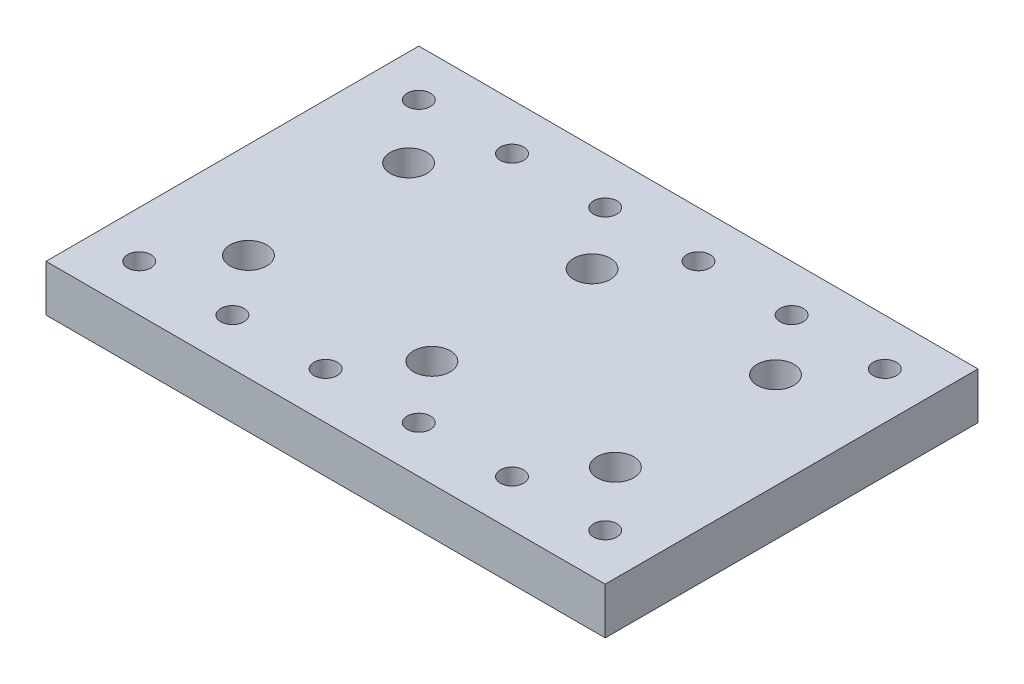
ISO-10303-21;
HEADER;
FILE_DESCRIPTION(('STEP AP214'),'2;1');
FILE_NAME('part.step','',(''),(''),'','','');
FILE_SCHEMA(('AUTOMOTIVE_DESIGN { 1 0 10303 214 1 1 1 1 }'));
ENDSEC;
DATA;
#1=APPLICATION_CONTEXT('core data for automotive mechanical design processes');
#2=APPLICATION_PROTOCOL_DEFINITION('international standard','automotive_design',2000,#1);
#3=PRODUCT_CONTEXT('',#1,'mechanical');
#4=PRODUCT('Part','Part','',(#3));
#5=PRODUCT_RELATED_PRODUCT_CATEGORY('part','',(#4));
#6=PRODUCT_DEFINITION_FORMATION('','',#4);
#7=PRODUCT_DEFINITION_CONTEXT('part definition',#1,'design');
#8=PRODUCT_DEFINITION('design','',#6,#7);
#9=PRODUCT_DEFINITION_SHAPE('','',#8);
#10=(LENGTH_UNIT() NAMED_UNIT(*) SI_UNIT(.MILLI.,.METRE.));
#11=(NAMED_UNIT(*) PLANE_ANGLE_UNIT() SI_UNIT($,.RADIAN.));
#12=(NAMED_UNIT(*) SI_UNIT($,.STERADIAN.) SOLID_ANGLE_UNIT());
#13=UNCERTAINTY_MEASURE_WITH_UNIT(LENGTH_MEASURE(1.E-05),#10,'distance_accuracy_value','');
#14=(GEOMETRIC_REPRESENTATION_CONTEXT(3) GLOBAL_UNCERTAINTY_ASSIGNED_CONTEXT((#13)) GLOBAL_UNIT_ASSIGNED_CONTEXT((#10,
#11,#12)) REPRESENTATION_CONTEXT('',''));
#15=CARTESIAN_POINT('',(0.,0.,0.));
#16=DIRECTION('',(0.,0.,1.));
#17=DIRECTION('',(1.,0.,0.));
#18=AXIS2_PLACEMENT_3D('',#15,#16,#17);
#19=CARTESIAN_POINT('',(76.2,12.7,50.8));
#20=DIRECTION('',(-1.,0.,0.));
#21=DIRECTION('',(0.,0.,1.));
#22=AXIS2_PLACEMENT_3D('',#19,#20,#21);
#23=PLANE('',#22);
#24=DIRECTION('',(0.,0.,-1.));
#25=VECTOR('',#24,1.);
#26=CARTESIAN_POINT('',(76.2,0.,50.8));
#27=LINE('',#26,#25);
#28=CARTESIAN_POINT('',(76.2,0.,50.8));
#29=VERTEX_POINT('',#28);
#30=CARTESIAN_POINT('',(76.2,0.,-50.8));
#31=VERTEX_POINT('',#30);
#32=EDGE_CURVE('E95',#29,#31,#27,.T.);
#33=ORIENTED_EDGE('',*,*,#32,.T.);
#34=DIRECTION('',(0.,-1.,0.));
#35=VECTOR('',#34,1.);
#36=CARTESIAN_POINT('',(76.2,12.7,-50.8));
#37=LINE('',#36,#35);
#38=CARTESIAN_POINT('',(76.2,12.7,-50.8));
#39=VERTEX_POINT('',#38);
#40=EDGE_CURVE('E11',#39,#31,#37,.T.);
#41=ORIENTED_EDGE('',*,*,#40,.F.);
#42=DIRECTION('',(0.,0.,-1.));
#43=VECTOR('',#42,1.);
#44=CARTESIAN_POINT('',(76.2,12.7,50.8));
#45=LINE('',#44,#43);
#46=CARTESIAN_POINT('',(76.2,12.7,50.8));
#47=VERTEX_POINT('',#46);
#48=EDGE_CURVE('E83',#47,#39,#45,.T.);
#49=ORIENTED_EDGE('',*,*,#48,.F.);
#50=DIRECTION('',(0.,-1.,0.));
#51=VECTOR('',#50,1.);
#52=CARTESIAN_POINT('',(76.2,12.7,50.8));
#53=LINE('',#52,#51);
#54=EDGE_CURVE('E91',#47,#29,#53,.T.);
#55=ORIENTED_EDGE('',*,*,#54,.T.);
#56=EDGE_LOOP('',(#33,#41,#49,#55));
#57=FACE_BOUND('',#56,.T.);
#58=ADVANCED_FACE('F32',(#57),#23,.F.);
#59=CARTESIAN_POINT('',(-76.2,12.7,-50.8));
#60=DIRECTION('',(0.,0.,1.));
#61=DIRECTION('',(1.,0.,0.));
#62=AXIS2_PLACEMENT_3D('',#59,#60,#61);
#63=PLANE('',#62);
#64=DIRECTION('',(-1.,0.,0.));
#65=VECTOR('',#64,1.);
#66=CARTESIAN_POINT('',(-76.2,0.,-50.8));
#67=LINE('',#66,#65);
#68=CARTESIAN_POINT('',(-76.2,0.,-50.8));
#69=VERTEX_POINT('',#68);
#70=EDGE_CURVE('E87',#31,#69,#67,.T.);
#71=ORIENTED_EDGE('',*,*,#70,.T.);
#72=DIRECTION('',(0.,-1.,0.));
#73=VECTOR('',#72,1.);
#74=CARTESIAN_POINT('',(-76.2,12.7,-50.8));
#75=LINE('',#74,#73);
#76=CARTESIAN_POINT('',(-76.2,12.7,-50.8));
#77=VERTEX_POINT('',#76);
#78=EDGE_CURVE('E40',#77,#69,#75,.T.);
#79=ORIENTED_EDGE('',*,*,#78,.F.);
#80=DIRECTION('',(-1.,0.,0.));
#81=VECTOR('',#80,1.);
#82=CARTESIAN_POINT('',(-76.2,12.7,-50.8));
#83=LINE('',#82,#81);
#84=EDGE_CURVE('E78',#39,#77,#83,.T.);
#85=ORIENTED_EDGE('',*,*,#84,.F.);
#86=ORIENTED_EDGE('',*,*,#40,.T.);
#87=EDGE_LOOP('',(#71,#79,#85,#86));
#88=FACE_BOUND('',#87,.T.);
#89=ADVANCED_FACE('F86',(#88),#63,.F.);
#90=CARTESIAN_POINT('',(-76.2,12.7,50.8));
#91=DIRECTION('',(1.,0.,0.));
#92=DIRECTION('',(0.,0.,-1.));
#93=AXIS2_PLACEMENT_3D('',#90,#91,#92);
#94=PLANE('',#93);
#95=DIRECTION('',(0.,0.,1.));
#96=VECTOR('',#95,1.);
#97=CARTESIAN_POINT('',(-76.2,0.,50.8));
#98=LINE('',#97,#96);
#99=CARTESIAN_POINT('',(-76.2,0.,50.8));
#100=VERTEX_POINT('',#99);
#101=EDGE_CURVE('E65',#69,#100,#98,.T.);
#102=ORIENTED_EDGE('',*,*,#101,.T.);
#103=DIRECTION('',(0.,-1.,0.));
#104=VECTOR('',#103,1.);
#105=CARTESIAN_POINT('',(-76.2,12.7,50.8));
#106=LINE('',#105,#104);
#107=CARTESIAN_POINT('',(-76.2,12.7,50.8));
#108=VERTEX_POINT('',#107);
#109=EDGE_CURVE('E88',#108,#100,#106,.T.);
#110=ORIENTED_EDGE('',*,*,#109,.F.);
#111=DIRECTION('',(0.,0.,1.));
#112=VECTOR('',#111,1.);
#113=CARTESIAN_POINT('',(-76.2,12.7,50.8));
#114=LINE('',#113,#112);
#115=EDGE_CURVE('E81',#77,#108,#114,.T.);
#116=ORIENTED_EDGE('',*,*,#115,.F.);
#117=ORIENTED_EDGE('',*,*,#78,.T.);
#118=EDGE_LOOP('',(#102,#110,#116,#117));
#119=FACE_BOUND('',#118,.T.);
#120=ADVANCED_FACE('F89',(#119),#94,.F.);
#121=CARTESIAN_POINT('',(-76.2,12.7,50.8));
#122=DIRECTION('',(0.,0.,-1.));
#123=DIRECTION('',(-1.,0.,0.));
#124=AXIS2_PLACEMENT_3D('',#121,#122,#123);
#125=PLANE('',#124);
#126=DIRECTION('',(1.,0.,0.));
#127=VECTOR('',#126,1.);
#128=CARTESIAN_POINT('',(-76.2,0.,50.8));
#129=LINE('',#128,#127);
#130=EDGE_CURVE('E71',#100,#29,#129,.T.);
#131=ORIENTED_EDGE('',*,*,#130,.T.);
#132=ORIENTED_EDGE('',*,*,#54,.F.);
#133=DIRECTION('',(1.,0.,0.));
#134=VECTOR('',#133,1.);
#135=CARTESIAN_POINT('',(-76.2,12.7,50.8));
#136=LINE('',#135,#134);
#137=EDGE_CURVE('E48',#108,#47,#136,.T.);
#138=ORIENTED_EDGE('',*,*,#137,.F.);
#139=ORIENTED_EDGE('',*,*,#109,.T.);
#140=EDGE_LOOP('',(#131,#132,#138,#139));
#141=FACE_BOUND('',#140,.T.);
#142=ADVANCED_FACE('F103',(#141),#125,.F.);
#143=CARTESIAN_POINT('',(0.,12.7,0.));
#144=DIRECTION('',(0.,-1.,0.));
#145=DIRECTION('',(0.,0.,-1.));
#146=AXIS2_PLACEMENT_3D('',#143,#144,#145);
#147=PLANE('',#146);
#148=CARTESIAN_POINT('',(-38.1,12.7,38.1));
#149=DIRECTION('',(0.,1.,0.));
#150=DIRECTION('',(0.,0.,1.));
#151=AXIS2_PLACEMENT_3D('',#148,#149,#150);
#152=CIRCLE('',#151,3.175);
#153=CARTESIAN_POINT('',(-38.1,12.7,41.275));
#154=VERTEX_POINT('',#153);
#155=EDGE_CURVE('E211',#154,#154,#152,.T.);
#156=ORIENTED_EDGE('',*,*,#155,.F.);
#157=EDGE_LOOP('',(#156));
#158=FACE_BOUND('',#157,.T.);
#159=CARTESIAN_POINT('',(-12.7,12.7,38.1));
#160=DIRECTION('',(0.,1.,0.));
#161=DIRECTION('',(0.,0.,1.));
#162=AXIS2_PLACEMENT_3D('',#159,#160,#161);
#163=CIRCLE('',#162,3.175);
#164=CARTESIAN_POINT('',(-12.7,12.7,41.275));
#165=VERTEX_POINT('',#164);
#166=EDGE_CURVE('E205',#165,#165,#163,.T.);
#167=ORIENTED_EDGE('',*,*,#166,.F.);
#168=EDGE_LOOP('',(#167));
#169=FACE_BOUND('',#168,.T.);
#170=CARTESIAN_POINT('',(12.7,12.7,38.1));
#171=DIRECTION('',(0.,1.,0.));
#172=DIRECTION('',(0.,0.,1.));
#173=AXIS2_PLACEMENT_3D('',#170,#171,#172);
#174=CIRCLE('',#173,3.175);
#175=CARTESIAN_POINT('',(12.7,12.7,41.275));
#176=VERTEX_POINT('',#175);
#177=EDGE_CURVE('E199',#176,#176,#174,.T.);
#178=ORIENTED_EDGE('',*,*,#177,.F.);
#179=EDGE_LOOP('',(#178));
#180=FACE_BOUND('',#179,.T.);
#181=CARTESIAN_POINT('',(38.1,12.7,38.1));
#182=DIRECTION('',(0.,1.,0.));
#183=DIRECTION('',(0.,0.,1.));
#184=AXIS2_PLACEMENT_3D('',#181,#182,#183);
#185=CIRCLE('',#184,3.175);
#186=CARTESIAN_POINT('',(38.1,12.7,41.275));
#187=VERTEX_POINT('',#186);
#188=EDGE_CURVE('E193',#187,#187,#185,.T.);
#189=ORIENTED_EDGE('',*,*,#188,.F.);
#190=EDGE_LOOP('',(#189));
#191=FACE_BOUND('',#190,.T.);
#192=CARTESIAN_POINT('',(63.5,12.7,38.1));
#193=DIRECTION('',(0.,1.,0.));
#194=DIRECTION('',(0.,0.,1.));
#195=AXIS2_PLACEMENT_3D('',#192,#193,#194);
#196=CIRCLE('',#195,3.175);
#197=CARTESIAN_POINT('',(63.5,12.7,41.275));
#198=VERTEX_POINT('',#197);
#199=EDGE_CURVE('E170',#198,#198,#196,.T.);
#200=ORIENTED_EDGE('',*,*,#199,.F.);
#201=EDGE_LOOP('',(#200));
#202=FACE_BOUND('',#201,.T.);
#203=CARTESIAN_POINT('',(38.0999999999997,12.7,-38.1));
#204=DIRECTION('',(0.,1.,0.));
#205=DIRECTION('',(0.,0.,1.));
#206=AXIS2_PLACEMENT_3D('',#203,#204,#205);
#207=CIRCLE('',#206,3.175);
#208=CARTESIAN_POINT('',(38.0999999999997,12.7,-34.925));
#209=VERTEX_POINT('',#208);
#210=EDGE_CURVE('E171',#209,#209,#207,.T.);
#211=ORIENTED_EDGE('',*,*,#210,.F.);
#212=EDGE_LOOP('',(#211));
#213=FACE_BOUND('',#212,.T.);
#214=CARTESIAN_POINT('',(63.4999999999997,12.7,-38.1));
#215=DIRECTION('',(0.,1.,0.));
#216=DIRECTION('',(0.,0.,1.));
#217=AXIS2_PLACEMENT_3D('',#214,#215,#216);
#218=CIRCLE('',#217,3.175);
#219=CARTESIAN_POINT('',(63.4999999999997,12.7,-34.925));
#220=VERTEX_POINT('',#219);
#221=EDGE_CURVE('E183',#220,#220,#218,.T.);
#222=ORIENTED_EDGE('',*,*,#221,.F.);
#223=EDGE_LOOP('',(#222));
#224=FACE_BOUND('',#223,.T.);
#225=CARTESIAN_POINT('',(-63.5000000000002,12.7,-38.1));
#226=DIRECTION('',(0.,1.,0.));
#227=DIRECTION('',(0.,0.,1.));
#228=AXIS2_PLACEMENT_3D('',#225,#226,#227);
#229=CIRCLE('',#228,3.175);
#230=CARTESIAN_POINT('',(-63.5000000000002,12.7,-34.925));
#231=VERTEX_POINT('',#230);
#232=EDGE_CURVE('E177',#231,#231,#229,.T.);
#233=ORIENTED_EDGE('',*,*,#232,.F.);
#234=EDGE_LOOP('',(#233));
#235=FACE_BOUND('',#234,.T.);
#236=CARTESIAN_POINT('',(12.6999999999997,12.7,-38.1));
#237=DIRECTION('',(0.,1.,0.));
#238=DIRECTION('',(0.,0.,1.));
#239=AXIS2_PLACEMENT_3D('',#236,#237,#238);
#240=CIRCLE('',#239,3.175);
#241=CARTESIAN_POINT('',(12.6999999999997,12.7,-34.925));
#242=VERTEX_POINT('',#241);
#243=EDGE_CURVE('E151',#242,#242,#240,.T.);
#244=ORIENTED_EDGE('',*,*,#243,.F.);
#245=EDGE_LOOP('',(#244));
#246=FACE_BOUND('',#245,.T.);
#247=CARTESIAN_POINT('',(-12.7000000000003,12.7,-38.1));
#248=DIRECTION('',(0.,1.,0.));
#249=DIRECTION('',(0.,0.,1.));
#250=AXIS2_PLACEMENT_3D('',#247,#248,#249);
#251=CIRCLE('',#250,3.175);
#252=CARTESIAN_POINT('',(-12.7000000000003,12.7,-34.925));
#253=VERTEX_POINT('',#252);
#254=EDGE_CURVE('E158',#253,#253,#251,.T.);
#255=ORIENTED_EDGE('',*,*,#254,.F.);
#256=EDGE_LOOP('',(#255));
#257=FACE_BOUND('',#256,.T.);
#258=CARTESIAN_POINT('',(-38.1000000000003,12.7,-38.1));
#259=DIRECTION('',(0.,1.,0.));
#260=DIRECTION('',(0.,0.,1.));
#261=AXIS2_PLACEMENT_3D('',#258,#259,#260);
#262=CIRCLE('',#261,3.175);
#263=CARTESIAN_POINT('',(-38.1000000000003,12.7,-34.925));
#264=VERTEX_POINT('',#263);
#265=EDGE_CURVE('E164',#264,#264,#262,.T.);
#266=ORIENTED_EDGE('',*,*,#265,.F.);
#267=EDGE_LOOP('',(#266));
#268=FACE_BOUND('',#267,.T.);
#269=CARTESIAN_POINT('',(-63.5,12.7,38.1));
#270=DIRECTION('',(0.,1.,0.));
#271=DIRECTION('',(0.,0.,1.));
#272=AXIS2_PLACEMENT_3D('',#269,#270,#271);
#273=CIRCLE('',#272,3.175);
#274=CARTESIAN_POINT('',(-63.5,12.7,41.275));
#275=VERTEX_POINT('',#274);
#276=EDGE_CURVE('E145',#275,#275,#273,.T.);
#277=ORIENTED_EDGE('',*,*,#276,.F.);
#278=EDGE_LOOP('',(#277));
#279=FACE_BOUND('',#278,.T.);
#280=CARTESIAN_POINT('',(49.9957939432397,12.7,-21.825));
#281=DIRECTION('',(0.,-1.,0.));
#282=DIRECTION('',(0.,0.,-1.));
#283=AXIS2_PLACEMENT_3D('',#280,#281,#282);
#284=CIRCLE('',#283,4.99999999999999);
#285=CARTESIAN_POINT('',(49.9957939432397,12.7,-26.825));
#286=VERTEX_POINT('',#285);
#287=EDGE_CURVE('E130',#286,#286,#284,.T.);
#288=ORIENTED_EDGE('',*,*,#287,.T.);
#289=EDGE_LOOP('',(#288));
#290=FACE_BOUND('',#289,.T.);
#291=CARTESIAN_POINT('',(49.9957939432397,12.7,21.825));
#292=DIRECTION('',(0.,-1.,0.));
#293=DIRECTION('',(0.,0.,-1.));
#294=AXIS2_PLACEMENT_3D('',#291,#292,#293);
#295=CIRCLE('',#294,4.99999999999999);
#296=CARTESIAN_POINT('',(49.9957939432397,12.7,16.825));
#297=VERTEX_POINT('',#296);
#298=EDGE_CURVE('E137',#297,#297,#295,.T.);
#299=ORIENTED_EDGE('',*,*,#298,.T.);
#300=EDGE_LOOP('',(#299));
#301=FACE_BOUND('',#300,.T.);
#302=CARTESIAN_POINT('',(-0.00420605676025587,12.7,-21.825));
#303=DIRECTION('',(0.,-1.,0.));
#304=DIRECTION('',(0.,0.,-1.));
#305=AXIS2_PLACEMENT_3D('',#302,#303,#304);
#306=CIRCLE('',#305,4.99999999999999);
#307=CARTESIAN_POINT('',(-0.00420605676025587,12.7,-26.825));
#308=VERTEX_POINT('',#307);
#309=EDGE_CURVE('E119',#308,#308,#306,.T.);
#310=ORIENTED_EDGE('',*,*,#309,.T.);
#311=EDGE_LOOP('',(#310));
#312=FACE_BOUND('',#311,.T.);
#313=CARTESIAN_POINT('',(-0.00420605676025587,12.7,21.825));
#314=DIRECTION('',(0.,-1.,0.));
#315=DIRECTION('',(0.,0.,-1.));
#316=AXIS2_PLACEMENT_3D('',#313,#314,#315);
#317=CIRCLE('',#316,4.99999999999999);
#318=CARTESIAN_POINT('',(-0.00420605676025587,12.7,16.825));
#319=VERTEX_POINT('',#318);
#320=EDGE_CURVE('E118',#319,#319,#317,.T.);
#321=ORIENTED_EDGE('',*,*,#320,.T.);
#322=EDGE_LOOP('',(#321));
#323=FACE_BOUND('',#322,.T.);
#324=CARTESIAN_POINT('',(-50.0042060567603,12.7,-21.825));
#325=DIRECTION('',(0.,-1.,0.));
#326=DIRECTION('',(0.,0.,-1.));
#327=AXIS2_PLACEMENT_3D('',#324,#325,#326);
#328=CIRCLE('',#327,4.99999999999999);
#329=CARTESIAN_POINT('',(-50.0042060567603,12.7,-26.825));
#330=VERTEX_POINT('',#329);
#331=EDGE_CURVE('E112',#330,#330,#328,.T.);
#332=ORIENTED_EDGE('',*,*,#331,.T.);
#333=EDGE_LOOP('',(#332));
#334=FACE_BOUND('',#333,.T.);
#335=CARTESIAN_POINT('',(-50.0042060567603,12.7,21.825));
#336=DIRECTION('',(0.,-1.,0.));
#337=DIRECTION('',(0.,0.,-1.));
#338=AXIS2_PLACEMENT_3D('',#335,#336,#337);
#339=CIRCLE('',#338,4.99999999999999);
#340=CARTESIAN_POINT('',(-50.0042060567603,12.7,16.825));
#341=VERTEX_POINT('',#340);
#342=EDGE_CURVE('E98',#341,#341,#339,.T.);
#343=ORIENTED_EDGE('',*,*,#342,.T.);
#344=EDGE_LOOP('',(#343));
#345=FACE_BOUND('',#344,.T.);
#346=ORIENTED_EDGE('',*,*,#48,.T.);
#347=ORIENTED_EDGE('',*,*,#84,.T.);
#348=ORIENTED_EDGE('',*,*,#115,.T.);
#349=ORIENTED_EDGE('',*,*,#137,.T.);
#350=EDGE_LOOP('',(#346,#347,#348,#349));
#351=FACE_BOUND('',#350,.T.);
#352=ADVANCED_FACE('F79',(#158,#169,#180,#191,#202,#213,#224,#235,#246,#257,#268,#279,#290,#301,
#312,#323,#334,#345,#351),#147,.F.);
#353=CARTESIAN_POINT('',(0.,0.,0.));
#354=DIRECTION('',(0.,-1.,0.));
#355=DIRECTION('',(0.,0.,-1.));
#356=AXIS2_PLACEMENT_3D('',#353,#354,#355);
#357=PLANE('',#356);
#358=CARTESIAN_POINT('',(-38.1,0.,38.1));
#359=DIRECTION('',(0.,1.,0.));
#360=DIRECTION('',(0.,0.,1.));
#361=AXIS2_PLACEMENT_3D('',#358,#359,#360);
#362=CIRCLE('',#361,3.175);
#363=CARTESIAN_POINT('',(-38.1,0.,41.275));
#364=VERTEX_POINT('',#363);
#365=EDGE_CURVE('E148',#364,#364,#362,.T.);
#366=ORIENTED_EDGE('',*,*,#365,.T.);
#367=EDGE_LOOP('',(#366));
#368=FACE_BOUND('',#367,.T.);
#369=CARTESIAN_POINT('',(-12.7,0.,38.1));
#370=DIRECTION('',(0.,1.,0.));
#371=DIRECTION('',(0.,0.,1.));
#372=AXIS2_PLACEMENT_3D('',#369,#370,#371);
#373=CIRCLE('',#372,3.175);
#374=CARTESIAN_POINT('',(-12.7,0.,41.275));
#375=VERTEX_POINT('',#374);
#376=EDGE_CURVE('E208',#375,#375,#373,.T.);
#377=ORIENTED_EDGE('',*,*,#376,.T.);
#378=EDGE_LOOP('',(#377));
#379=FACE_BOUND('',#378,.T.);
#380=CARTESIAN_POINT('',(12.7,0.,38.1));
#381=DIRECTION('',(0.,1.,0.));
#382=DIRECTION('',(0.,0.,1.));
#383=AXIS2_PLACEMENT_3D('',#380,#381,#382);
#384=CIRCLE('',#383,3.175);
#385=CARTESIAN_POINT('',(12.7,0.,41.275));
#386=VERTEX_POINT('',#385);
#387=EDGE_CURVE('E202',#386,#386,#384,.T.);
#388=ORIENTED_EDGE('',*,*,#387,.T.);
#389=EDGE_LOOP('',(#388));
#390=FACE_BOUND('',#389,.T.);
#391=CARTESIAN_POINT('',(38.1,0.,38.1));
#392=DIRECTION('',(0.,1.,0.));
#393=DIRECTION('',(0.,0.,1.));
#394=AXIS2_PLACEMENT_3D('',#391,#392,#393);
#395=CIRCLE('',#394,3.175);
#396=CARTESIAN_POINT('',(38.1,0.,41.275));
#397=VERTEX_POINT('',#396);
#398=EDGE_CURVE('E196',#397,#397,#395,.T.);
#399=ORIENTED_EDGE('',*,*,#398,.T.);
#400=EDGE_LOOP('',(#399));
#401=FACE_BOUND('',#400,.T.);
#402=CARTESIAN_POINT('',(63.5,0.,38.1));
#403=DIRECTION('',(0.,1.,0.));
#404=DIRECTION('',(0.,0.,1.));
#405=AXIS2_PLACEMENT_3D('',#402,#403,#404);
#406=CIRCLE('',#405,3.175);
#407=CARTESIAN_POINT('',(63.5,0.,41.275));
#408=VERTEX_POINT('',#407);
#409=EDGE_CURVE('E190',#408,#408,#406,.T.);
#410=ORIENTED_EDGE('',*,*,#409,.T.);
#411=EDGE_LOOP('',(#410));
#412=FACE_BOUND('',#411,.T.);
#413=CARTESIAN_POINT('',(38.0999999999997,0.,-38.1));
#414=DIRECTION('',(0.,1.,0.));
#415=DIRECTION('',(0.,0.,1.));
#416=AXIS2_PLACEMENT_3D('',#413,#414,#415);
#417=CIRCLE('',#416,3.175);
#418=CARTESIAN_POINT('',(38.0999999999997,0.,-34.925));
#419=VERTEX_POINT('',#418);
#420=EDGE_CURVE('E155',#419,#419,#417,.T.);
#421=ORIENTED_EDGE('',*,*,#420,.T.);
#422=EDGE_LOOP('',(#421));
#423=FACE_BOUND('',#422,.T.);
#424=CARTESIAN_POINT('',(63.4999999999997,0.,-38.1));
#425=DIRECTION('',(0.,1.,0.));
#426=DIRECTION('',(0.,0.,1.));
#427=AXIS2_PLACEMENT_3D('',#424,#425,#426);
#428=CIRCLE('',#427,3.175);
#429=CARTESIAN_POINT('',(63.4999999999997,0.,-34.925));
#430=VERTEX_POINT('',#429);
#431=EDGE_CURVE('E174',#430,#430,#428,.T.);
#432=ORIENTED_EDGE('',*,*,#431,.T.);
#433=EDGE_LOOP('',(#432));
#434=FACE_BOUND('',#433,.T.);
#435=CARTESIAN_POINT('',(-63.5000000000002,0.,-38.1));
#436=DIRECTION('',(0.,1.,0.));
#437=DIRECTION('',(0.,0.,1.));
#438=AXIS2_PLACEMENT_3D('',#435,#436,#437);
#439=CIRCLE('',#438,3.175);
#440=CARTESIAN_POINT('',(-63.5000000000002,0.,-34.925));
#441=VERTEX_POINT('',#440);
#442=EDGE_CURVE('E180',#441,#441,#439,.T.);
#443=ORIENTED_EDGE('',*,*,#442,.T.);
#444=EDGE_LOOP('',(#443));
#445=FACE_BOUND('',#444,.T.);
#446=CARTESIAN_POINT('',(12.6999999999997,0.,-38.1));
#447=DIRECTION('',(0.,1.,0.));
#448=DIRECTION('',(0.,0.,1.));
#449=AXIS2_PLACEMENT_3D('',#446,#447,#448);
#450=CIRCLE('',#449,3.175);
#451=CARTESIAN_POINT('',(12.6999999999997,0.,-34.925));
#452=VERTEX_POINT('',#451);
#453=EDGE_CURVE('E154',#452,#452,#450,.T.);
#454=ORIENTED_EDGE('',*,*,#453,.T.);
#455=EDGE_LOOP('',(#454));
#456=FACE_BOUND('',#455,.T.);
#457=CARTESIAN_POINT('',(-12.7000000000003,0.,-38.1));
#458=DIRECTION('',(0.,1.,0.));
#459=DIRECTION('',(0.,0.,1.));
#460=AXIS2_PLACEMENT_3D('',#457,#458,#459);
#461=CIRCLE('',#460,3.175);
#462=CARTESIAN_POINT('',(-12.7000000000003,0.,-34.925));
#463=VERTEX_POINT('',#462);
#464=EDGE_CURVE('E161',#463,#463,#461,.T.);
#465=ORIENTED_EDGE('',*,*,#464,.T.);
#466=EDGE_LOOP('',(#465));
#467=FACE_BOUND('',#466,.T.);
#468=CARTESIAN_POINT('',(-38.1000000000003,0.,-38.1));
#469=DIRECTION('',(0.,1.,0.));
#470=DIRECTION('',(0.,0.,1.));
#471=AXIS2_PLACEMENT_3D('',#468,#469,#470);
#472=CIRCLE('',#471,3.175);
#473=CARTESIAN_POINT('',(-38.1000000000003,0.,-34.925));
#474=VERTEX_POINT('',#473);
#475=EDGE_CURVE('E167',#474,#474,#472,.T.);
#476=ORIENTED_EDGE('',*,*,#475,.T.);
#477=EDGE_LOOP('',(#476));
#478=FACE_BOUND('',#477,.T.);
#479=CARTESIAN_POINT('',(-63.5,0.,38.1));
#480=DIRECTION('',(0.,1.,0.));
#481=DIRECTION('',(0.,0.,1.));
#482=AXIS2_PLACEMENT_3D('',#479,#480,#481);
#483=CIRCLE('',#482,3.175);
#484=CARTESIAN_POINT('',(-63.5,0.,41.275));
#485=VERTEX_POINT('',#484);
#486=EDGE_CURVE('E131',#485,#485,#483,.T.);
#487=ORIENTED_EDGE('',*,*,#486,.T.);
#488=EDGE_LOOP('',(#487));
#489=FACE_BOUND('',#488,.T.);
#490=CARTESIAN_POINT('',(49.9957939432397,0.,-21.825));
#491=DIRECTION('',(0.,-1.,0.));
#492=DIRECTION('',(0.,0.,-1.));
#493=AXIS2_PLACEMENT_3D('',#490,#491,#492);
#494=CIRCLE('',#493,4.99999999999999);
#495=CARTESIAN_POINT('',(49.9957939432397,0.,-26.825));
#496=VERTEX_POINT('',#495);
#497=EDGE_CURVE('E127',#496,#496,#494,.T.);
#498=ORIENTED_EDGE('',*,*,#497,.F.);
#499=EDGE_LOOP('',(#498));
#500=FACE_BOUND('',#499,.T.);
#501=CARTESIAN_POINT('',(49.9957939432397,0.,21.825));
#502=DIRECTION('',(0.,-1.,0.));
#503=DIRECTION('',(0.,0.,-1.));
#504=AXIS2_PLACEMENT_3D('',#501,#502,#503);
#505=CIRCLE('',#504,4.99999999999999);
#506=CARTESIAN_POINT('',(49.9957939432397,0.,16.825));
#507=VERTEX_POINT('',#506);
#508=EDGE_CURVE('E134',#507,#507,#505,.T.);
#509=ORIENTED_EDGE('',*,*,#508,.F.);
#510=EDGE_LOOP('',(#509));
#511=FACE_BOUND('',#510,.T.);
#512=CARTESIAN_POINT('',(-0.00420605676025587,0.,-21.825));
#513=DIRECTION('',(0.,-1.,0.));
#514=DIRECTION('',(0.,0.,-1.));
#515=AXIS2_PLACEMENT_3D('',#512,#513,#514);
#516=CIRCLE('',#515,4.99999999999999);
#517=CARTESIAN_POINT('',(-0.00420605676025587,0.,-26.825));
#518=VERTEX_POINT('',#517);
#519=EDGE_CURVE('E140',#518,#518,#516,.T.);
#520=ORIENTED_EDGE('',*,*,#519,.F.);
#521=EDGE_LOOP('',(#520));
#522=FACE_BOUND('',#521,.T.);
#523=CARTESIAN_POINT('',(-0.00420605676025587,0.,21.825));
#524=DIRECTION('',(0.,-1.,0.));
#525=DIRECTION('',(0.,0.,-1.));
#526=AXIS2_PLACEMENT_3D('',#523,#524,#525);
#527=CIRCLE('',#526,4.99999999999999);
#528=CARTESIAN_POINT('',(-0.00420605676025587,0.,16.825));
#529=VERTEX_POINT('',#528);
#530=EDGE_CURVE('E115',#529,#529,#527,.T.);
#531=ORIENTED_EDGE('',*,*,#530,.F.);
#532=EDGE_LOOP('',(#531));
#533=FACE_BOUND('',#532,.T.);
#534=CARTESIAN_POINT('',(-50.0042060567603,0.,-21.825));
#535=DIRECTION('',(0.,-1.,0.));
#536=DIRECTION('',(0.,0.,-1.));
#537=AXIS2_PLACEMENT_3D('',#534,#535,#536);
#538=CIRCLE('',#537,4.99999999999999);
#539=CARTESIAN_POINT('',(-50.0042060567603,0.,-26.825));
#540=VERTEX_POINT('',#539);
#541=EDGE_CURVE('E122',#540,#540,#538,.T.);
#542=ORIENTED_EDGE('',*,*,#541,.F.);
#543=EDGE_LOOP('',(#542));
#544=FACE_BOUND('',#543,.T.);
#545=CARTESIAN_POINT('',(-50.0042060567603,0.,21.825));
#546=DIRECTION('',(0.,-1.,0.));
#547=DIRECTION('',(0.,0.,-1.));
#548=AXIS2_PLACEMENT_3D('',#545,#546,#547);
#549=CIRCLE('',#548,4.99999999999999);
#550=CARTESIAN_POINT('',(-50.0042060567603,0.,16.825));
#551=VERTEX_POINT('',#550);
#552=EDGE_CURVE('E109',#551,#551,#549,.T.);
#553=ORIENTED_EDGE('',*,*,#552,.F.);
#554=EDGE_LOOP('',(#553));
#555=FACE_BOUND('',#554,.T.);
#556=ORIENTED_EDGE('',*,*,#32,.F.);
#557=ORIENTED_EDGE('',*,*,#130,.F.);
#558=ORIENTED_EDGE('',*,*,#101,.F.);
#559=ORIENTED_EDGE('',*,*,#70,.F.);
#560=EDGE_LOOP('',(#556,#557,#558,#559));
#561=FACE_BOUND('',#560,.T.);
#562=ADVANCED_FACE('F106',(#368,#379,#390,#401,#412,#423,#434,#445,#456,#467,#478,#489,#500,
#511,#522,#533,#544,#555,#561),#357,.T.);
#563=CARTESIAN_POINT('',(-50.0042060567603,12.7,21.825));
#564=DIRECTION('',(0.,-1.,0.));
#565=DIRECTION('',(0.,0.,-1.));
#566=AXIS2_PLACEMENT_3D('',#563,#564,#565);
#567=CYLINDRICAL_SURFACE('',#566,4.99999999999999);
#568=ORIENTED_EDGE('',*,*,#342,.F.);
#569=EDGE_LOOP('',(#568));
#570=FACE_BOUND('',#569,.T.);
#571=ORIENTED_EDGE('',*,*,#552,.T.);
#572=EDGE_LOOP('',(#571));
#573=FACE_BOUND('',#572,.T.);
#574=ADVANCED_FACE('F263',(#570,#573),#567,.F.);
#575=CARTESIAN_POINT('',(-50.0042060567603,12.7,-21.825));
#576=DIRECTION('',(0.,-1.,0.));
#577=DIRECTION('',(0.,0.,-1.));
#578=AXIS2_PLACEMENT_3D('',#575,#576,#577);
#579=CYLINDRICAL_SURFACE('',#578,4.99999999999999);
#580=ORIENTED_EDGE('',*,*,#331,.F.);
#581=EDGE_LOOP('',(#580));
#582=FACE_BOUND('',#581,.T.);
#583=ORIENTED_EDGE('',*,*,#541,.T.);
#584=EDGE_LOOP('',(#583));
#585=FACE_BOUND('',#584,.T.);
#586=ADVANCED_FACE('F266',(#582,#585),#579,.F.);
#587=CARTESIAN_POINT('',(-0.00420605676025587,12.7,21.825));
#588=DIRECTION('',(0.,-1.,0.));
#589=DIRECTION('',(0.,0.,-1.));
#590=AXIS2_PLACEMENT_3D('',#587,#588,#589);
#591=CYLINDRICAL_SURFACE('',#590,4.99999999999999);
#592=ORIENTED_EDGE('',*,*,#320,.F.);
#593=EDGE_LOOP('',(#592));
#594=FACE_BOUND('',#593,.T.);
#595=ORIENTED_EDGE('',*,*,#530,.T.);
#596=EDGE_LOOP('',(#595));
#597=FACE_BOUND('',#596,.T.);
#598=ADVANCED_FACE('F430',(#594,#597),#591,.F.);
#599=CARTESIAN_POINT('',(-0.00420605676025587,12.7,-21.825));
#600=DIRECTION('',(0.,-1.,0.));
#601=DIRECTION('',(0.,0.,-1.));
#602=AXIS2_PLACEMENT_3D('',#599,#600,#601);
#603=CYLINDRICAL_SURFACE('',#602,4.99999999999999);
#604=ORIENTED_EDGE('',*,*,#309,.F.);
#605=EDGE_LOOP('',(#604));
#606=FACE_BOUND('',#605,.T.);
#607=ORIENTED_EDGE('',*,*,#519,.T.);
#608=EDGE_LOOP('',(#607));
#609=FACE_BOUND('',#608,.T.);
#610=ADVANCED_FACE('F426',(#606,#609),#603,.F.);
#611=CARTESIAN_POINT('',(49.9957939432397,12.7,21.825));
#612=DIRECTION('',(0.,-1.,0.));
#613=DIRECTION('',(0.,0.,-1.));
#614=AXIS2_PLACEMENT_3D('',#611,#612,#613);
#615=CYLINDRICAL_SURFACE('',#614,4.99999999999999);
#616=ORIENTED_EDGE('',*,*,#298,.F.);
#617=EDGE_LOOP('',(#616));
#618=FACE_BOUND('',#617,.T.);
#619=ORIENTED_EDGE('',*,*,#508,.T.);
#620=EDGE_LOOP('',(#619));
#621=FACE_BOUND('',#620,.T.);
#622=ADVANCED_FACE('F429',(#618,#621),#615,.F.);
#623=CARTESIAN_POINT('',(49.9957939432397,12.7,-21.825));
#624=DIRECTION('',(0.,-1.,0.));
#625=DIRECTION('',(0.,0.,-1.));
#626=AXIS2_PLACEMENT_3D('',#623,#624,#625);
#627=CYLINDRICAL_SURFACE('',#626,4.99999999999999);
#628=ORIENTED_EDGE('',*,*,#287,.F.);
#629=EDGE_LOOP('',(#628));
#630=FACE_BOUND('',#629,.T.);
#631=ORIENTED_EDGE('',*,*,#497,.T.);
#632=EDGE_LOOP('',(#631));
#633=FACE_BOUND('',#632,.T.);
#634=ADVANCED_FACE('F299',(#630,#633),#627,.F.);
#635=CARTESIAN_POINT('',(-63.5,0.,38.1));
#636=DIRECTION('',(0.,1.,0.));
#637=DIRECTION('',(0.,0.,1.));
#638=AXIS2_PLACEMENT_3D('',#635,#636,#637);
#639=CYLINDRICAL_SURFACE('',#638,3.175);
#640=ORIENTED_EDGE('',*,*,#486,.F.);
#641=EDGE_LOOP('',(#640));
#642=FACE_BOUND('',#641,.T.);
#643=ORIENTED_EDGE('',*,*,#276,.T.);
#644=EDGE_LOOP('',(#643));
#645=FACE_BOUND('',#644,.T.);
#646=ADVANCED_FACE('F309',(#642,#645),#639,.F.);
#647=CARTESIAN_POINT('',(-38.1000000000003,0.,-38.1));
#648=DIRECTION('',(0.,1.,0.));
#649=DIRECTION('',(0.,0.,1.));
#650=AXIS2_PLACEMENT_3D('',#647,#648,#649);
#651=CYLINDRICAL_SURFACE('',#650,3.175);
#652=ORIENTED_EDGE('',*,*,#475,.F.);
#653=EDGE_LOOP('',(#652));
#654=FACE_BOUND('',#653,.T.);
#655=ORIENTED_EDGE('',*,*,#265,.T.);
#656=EDGE_LOOP('',(#655));
#657=FACE_BOUND('',#656,.T.);
#658=ADVANCED_FACE('F314',(#654,#657),#651,.F.);
#659=CARTESIAN_POINT('',(-12.7000000000003,0.,-38.1));
#660=DIRECTION('',(0.,1.,0.));
#661=DIRECTION('',(0.,0.,1.));
#662=AXIS2_PLACEMENT_3D('',#659,#660,#661);
#663=CYLINDRICAL_SURFACE('',#662,3.175);
#664=ORIENTED_EDGE('',*,*,#464,.F.);
#665=EDGE_LOOP('',(#664));
#666=FACE_BOUND('',#665,.T.);
#667=ORIENTED_EDGE('',*,*,#254,.T.);
#668=EDGE_LOOP('',(#667));
#669=FACE_BOUND('',#668,.T.);
#670=ADVANCED_FACE('F324',(#666,#669),#663,.F.);
#671=CARTESIAN_POINT('',(12.6999999999997,0.,-38.1));
#672=DIRECTION('',(0.,1.,0.));
#673=DIRECTION('',(0.,0.,1.));
#674=AXIS2_PLACEMENT_3D('',#671,#672,#673);
#675=CYLINDRICAL_SURFACE('',#674,3.175);
#676=ORIENTED_EDGE('',*,*,#453,.F.);
#677=EDGE_LOOP('',(#676));
#678=FACE_BOUND('',#677,.T.);
#679=ORIENTED_EDGE('',*,*,#243,.T.);
#680=EDGE_LOOP('',(#679));
#681=FACE_BOUND('',#680,.T.);
#682=ADVANCED_FACE('F334',(#678,#681),#675,.F.);
#683=CARTESIAN_POINT('',(-63.5000000000002,0.,-38.1));
#684=DIRECTION('',(0.,1.,0.));
#685=DIRECTION('',(0.,0.,1.));
#686=AXIS2_PLACEMENT_3D('',#683,#684,#685);
#687=CYLINDRICAL_SURFACE('',#686,3.175);
#688=ORIENTED_EDGE('',*,*,#442,.F.);
#689=EDGE_LOOP('',(#688));
#690=FACE_BOUND('',#689,.T.);
#691=ORIENTED_EDGE('',*,*,#232,.T.);
#692=EDGE_LOOP('',(#691));
#693=FACE_BOUND('',#692,.T.);
#694=ADVANCED_FACE('F344',(#690,#693),#687,.F.);
#695=CARTESIAN_POINT('',(63.4999999999997,0.,-38.1));
#696=DIRECTION('',(0.,1.,0.));
#697=DIRECTION('',(0.,0.,1.));
#698=AXIS2_PLACEMENT_3D('',#695,#696,#697);
#699=CYLINDRICAL_SURFACE('',#698,3.175);
#700=ORIENTED_EDGE('',*,*,#431,.F.);
#701=EDGE_LOOP('',(#700));
#702=FACE_BOUND('',#701,.T.);
#703=ORIENTED_EDGE('',*,*,#221,.T.);
#704=EDGE_LOOP('',(#703));
#705=FACE_BOUND('',#704,.T.);
#706=ADVANCED_FACE('F354',(#702,#705),#699,.F.);
#707=CARTESIAN_POINT('',(38.0999999999997,0.,-38.1));
#708=DIRECTION('',(0.,1.,0.));
#709=DIRECTION('',(0.,0.,1.));
#710=AXIS2_PLACEMENT_3D('',#707,#708,#709);
#711=CYLINDRICAL_SURFACE('',#710,3.175);
#712=ORIENTED_EDGE('',*,*,#420,.F.);
#713=EDGE_LOOP('',(#712));
#714=FACE_BOUND('',#713,.T.);
#715=ORIENTED_EDGE('',*,*,#210,.T.);
#716=EDGE_LOOP('',(#715));
#717=FACE_BOUND('',#716,.T.);
#718=ADVANCED_FACE('F364',(#714,#717),#711,.F.);
#719=CARTESIAN_POINT('',(63.5,0.,38.1));
#720=DIRECTION('',(0.,1.,0.));
#721=DIRECTION('',(0.,0.,1.));
#722=AXIS2_PLACEMENT_3D('',#719,#720,#721);
#723=CYLINDRICAL_SURFACE('',#722,3.175);
#724=ORIENTED_EDGE('',*,*,#409,.F.);
#725=EDGE_LOOP('',(#724));
#726=FACE_BOUND('',#725,.T.);
#727=ORIENTED_EDGE('',*,*,#199,.T.);
#728=EDGE_LOOP('',(#727));
#729=FACE_BOUND('',#728,.T.);
#730=ADVANCED_FACE('F374',(#726,#729),#723,.F.);
#731=CARTESIAN_POINT('',(38.1,0.,38.1));
#732=DIRECTION('',(0.,1.,0.));
#733=DIRECTION('',(0.,0.,1.));
#734=AXIS2_PLACEMENT_3D('',#731,#732,#733);
#735=CYLINDRICAL_SURFACE('',#734,3.175);
#736=ORIENTED_EDGE('',*,*,#398,.F.);
#737=EDGE_LOOP('',(#736));
#738=FACE_BOUND('',#737,.T.);
#739=ORIENTED_EDGE('',*,*,#188,.T.);
#740=EDGE_LOOP('',(#739));
#741=FACE_BOUND('',#740,.T.);
#742=ADVANCED_FACE('F384',(#738,#741),#735,.F.);
#743=CARTESIAN_POINT('',(12.7,0.,38.1));
#744=DIRECTION('',(0.,1.,0.));
#745=DIRECTION('',(0.,0.,1.));
#746=AXIS2_PLACEMENT_3D('',#743,#744,#745);
#747=CYLINDRICAL_SURFACE('',#746,3.175);
#748=ORIENTED_EDGE('',*,*,#387,.F.);
#749=EDGE_LOOP('',(#748));
#750=FACE_BOUND('',#749,.T.);
#751=ORIENTED_EDGE('',*,*,#177,.T.);
#752=EDGE_LOOP('',(#751));
#753=FACE_BOUND('',#752,.T.);
#754=ADVANCED_FACE('F394',(#750,#753),#747,.F.);
#755=CARTESIAN_POINT('',(-12.7,0.,38.1));
#756=DIRECTION('',(0.,1.,0.));
#757=DIRECTION('',(0.,0.,1.));
#758=AXIS2_PLACEMENT_3D('',#755,#756,#757);
#759=CYLINDRICAL_SURFACE('',#758,3.175);
#760=ORIENTED_EDGE('',*,*,#376,.F.);
#761=EDGE_LOOP('',(#760));
#762=FACE_BOUND('',#761,.T.);
#763=ORIENTED_EDGE('',*,*,#166,.T.);
#764=EDGE_LOOP('',(#763));
#765=FACE_BOUND('',#764,.T.);
#766=ADVANCED_FACE('F222',(#762,#765),#759,.F.);
#767=CARTESIAN_POINT('',(-38.1,0.,38.1));
#768=DIRECTION('',(0.,1.,0.));
#769=DIRECTION('',(0.,0.,1.));
#770=AXIS2_PLACEMENT_3D('',#767,#768,#769);
#771=CYLINDRICAL_SURFACE('',#770,3.175);
#772=ORIENTED_EDGE('',*,*,#365,.F.);
#773=EDGE_LOOP('',(#772));
#774=FACE_BOUND('',#773,.T.);
#775=ORIENTED_EDGE('',*,*,#155,.T.);
#776=EDGE_LOOP('',(#775));
#777=FACE_BOUND('',#776,.T.);
#778=ADVANCED_FACE('F219',(#774,#777),#771,.F.);
#779=CLOSED_SHELL('',(#58,#89,#120,#142,#352,#562,#574,#586,#598,#610,#622,#634,#646,#658,#670,
#682,#694,#706,#718,#730,#742,#754,#766,#778));
#780=MANIFOLD_SOLID_BREP('B2',#779);
#781=ADVANCED_BREP_SHAPE_REPRESENTATION('',(#18,#780),#14);
#782=SHAPE_DEFINITION_REPRESENTATION(#9,#781);
ENDSEC;
END-ISO-10303-21;
